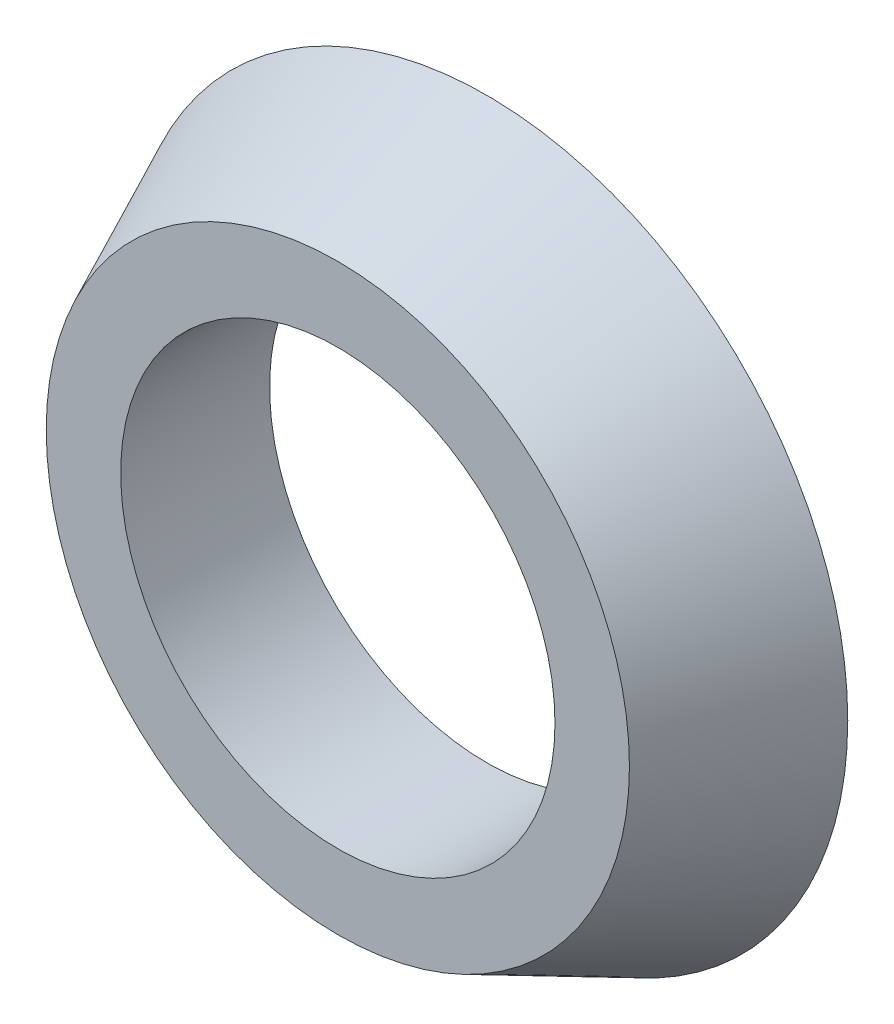
ISO-10303-21;
HEADER;
FILE_DESCRIPTION(('STEP AP214'),'2;1');
FILE_NAME('part.step','',(''),(''),'','','');
FILE_SCHEMA(('AUTOMOTIVE_DESIGN { 1 0 10303 214 1 1 1 1 }'));
ENDSEC;
DATA;
#1=APPLICATION_CONTEXT('core data for automotive mechanical design processes');
#2=APPLICATION_PROTOCOL_DEFINITION('international standard','automotive_design',2000,#1);
#3=PRODUCT_CONTEXT('',#1,'mechanical');
#4=PRODUCT('Part','Part','',(#3));
#5=PRODUCT_RELATED_PRODUCT_CATEGORY('part','',(#4));
#6=PRODUCT_DEFINITION_FORMATION('','',#4);
#7=PRODUCT_DEFINITION_CONTEXT('part definition',#1,'design');
#8=PRODUCT_DEFINITION('design','',#6,#7);
#9=PRODUCT_DEFINITION_SHAPE('','',#8);
#10=(LENGTH_UNIT() NAMED_UNIT(*) SI_UNIT(.MILLI.,.METRE.));
#11=(NAMED_UNIT(*) PLANE_ANGLE_UNIT() SI_UNIT($,.RADIAN.));
#12=(NAMED_UNIT(*) SI_UNIT($,.STERADIAN.) SOLID_ANGLE_UNIT());
#13=UNCERTAINTY_MEASURE_WITH_UNIT(LENGTH_MEASURE(1.E-05),#10,'distance_accuracy_value','');
#14=(GEOMETRIC_REPRESENTATION_CONTEXT(3) GLOBAL_UNCERTAINTY_ASSIGNED_CONTEXT((#13)) GLOBAL_UNIT_ASSIGNED_CONTEXT((#10,
#11,#12)) REPRESENTATION_CONTEXT('',''));
#15=CARTESIAN_POINT('',(0.,0.,0.));
#16=DIRECTION('',(0.,0.,1.));
#17=DIRECTION('',(1.,0.,0.));
#18=AXIS2_PLACEMENT_3D('',#15,#16,#17);
#19=CARTESIAN_POINT('',(0.,0.,0.));
#20=DIRECTION('',(0.,0.,-1.));
#21=DIRECTION('',(1.,0.,0.));
#22=AXIS2_PLACEMENT_3D('',#19,#20,#21);
#23=CONICAL_SURFACE('',#22,23.5,0.436332312998583);
#24=CARTESIAN_POINT('',(0.,0.,-12.));
#25=DIRECTION('',(0.,0.,1.));
#26=DIRECTION('',(1.,0.,0.));
#27=AXIS2_PLACEMENT_3D('',#24,#25,#26);
#28=CIRCLE('',#27,29.09569189786);
#29=CARTESIAN_POINT('',(29.09569189786,0.,-12.));
#30=VERTEX_POINT('',#29);
#31=EDGE_CURVE('E10',#30,#30,#28,.T.);
#32=ORIENTED_EDGE('',*,*,#31,.T.);
#33=EDGE_LOOP('',(#32));
#34=FACE_BOUND('',#33,.T.);
#35=CARTESIAN_POINT('',(0.,0.,0.));
#36=DIRECTION('',(0.,0.,1.));
#37=DIRECTION('',(1.,0.,0.));
#38=AXIS2_PLACEMENT_3D('',#35,#36,#37);
#39=CIRCLE('',#38,23.5);
#40=CARTESIAN_POINT('',(23.5,0.,0.));
#41=VERTEX_POINT('',#40);
#42=EDGE_CURVE('E41',#41,#41,#39,.T.);
#43=ORIENTED_EDGE('',*,*,#42,.F.);
#44=EDGE_LOOP('',(#43));
#45=FACE_BOUND('',#44,.T.);
#46=ADVANCED_FACE('F35',(#34,#45),#23,.T.);
#47=CARTESIAN_POINT('',(0.,0.,-12.));
#48=DIRECTION('',(0.,0.,1.));
#49=DIRECTION('',(1.,0.,0.));
#50=AXIS2_PLACEMENT_3D('',#47,#48,#49);
#51=PLANE('',#50);
#52=CARTESIAN_POINT('',(0.,0.,-12.));
#53=DIRECTION('',(0.,0.,1.));
#54=DIRECTION('',(1.,0.,0.));
#55=AXIS2_PLACEMENT_3D('',#52,#53,#54);
#56=CIRCLE('',#55,17.5);
#57=CARTESIAN_POINT('',(17.5,0.,-12.));
#58=VERTEX_POINT('',#57);
#59=EDGE_CURVE('E45',#58,#58,#56,.F.);
#60=ORIENTED_EDGE('',*,*,#59,.F.);
#61=EDGE_LOOP('',(#60));
#62=FACE_BOUND('',#61,.T.);
#63=ORIENTED_EDGE('',*,*,#31,.F.);
#64=EDGE_LOOP('',(#63));
#65=FACE_BOUND('',#64,.T.);
#66=ADVANCED_FACE('F60',(#62,#65),#51,.F.);
#67=CARTESIAN_POINT('',(0.,0.,0.));
#68=DIRECTION('',(0.,0.,1.));
#69=DIRECTION('',(1.,0.,0.));
#70=AXIS2_PLACEMENT_3D('',#67,#68,#69);
#71=PLANE('',#70);
#72=CARTESIAN_POINT('',(0.,0.,0.));
#73=DIRECTION('',(0.,0.,1.));
#74=DIRECTION('',(1.,0.,0.));
#75=AXIS2_PLACEMENT_3D('',#72,#73,#74);
#76=CIRCLE('',#75,17.5);
#77=CARTESIAN_POINT('',(17.5,0.,0.));
#78=VERTEX_POINT('',#77);
#79=EDGE_CURVE('E49',#78,#78,#76,.T.);
#80=ORIENTED_EDGE('',*,*,#79,.F.);
#81=EDGE_LOOP('',(#80));
#82=FACE_BOUND('',#81,.T.);
#83=ORIENTED_EDGE('',*,*,#42,.T.);
#84=EDGE_LOOP('',(#83));
#85=FACE_BOUND('',#84,.T.);
#86=ADVANCED_FACE('F58',(#82,#85),#71,.T.);
#87=CARTESIAN_POINT('',(0.,0.,-12.001));
#88=DIRECTION('',(0.,0.,1.));
#89=DIRECTION('',(1.,0.,0.));
#90=AXIS2_PLACEMENT_3D('',#87,#88,#89);
#91=CYLINDRICAL_SURFACE('',#90,17.5);
#92=ORIENTED_EDGE('',*,*,#79,.T.);
#93=EDGE_LOOP('',(#92));
#94=FACE_BOUND('',#93,.T.);
#95=ORIENTED_EDGE('',*,*,#59,.T.);
#96=EDGE_LOOP('',(#95));
#97=FACE_BOUND('',#96,.T.);
#98=ADVANCED_FACE('F55',(#94,#97),#91,.F.);
#99=CLOSED_SHELL('',(#46,#66,#86,#98));
#100=MANIFOLD_SOLID_BREP('B2',#99);
#101=ADVANCED_BREP_SHAPE_REPRESENTATION('',(#18,#100),#14);
#102=SHAPE_DEFINITION_REPRESENTATION(#9,#101);
ENDSEC;
END-ISO-10303-21;
